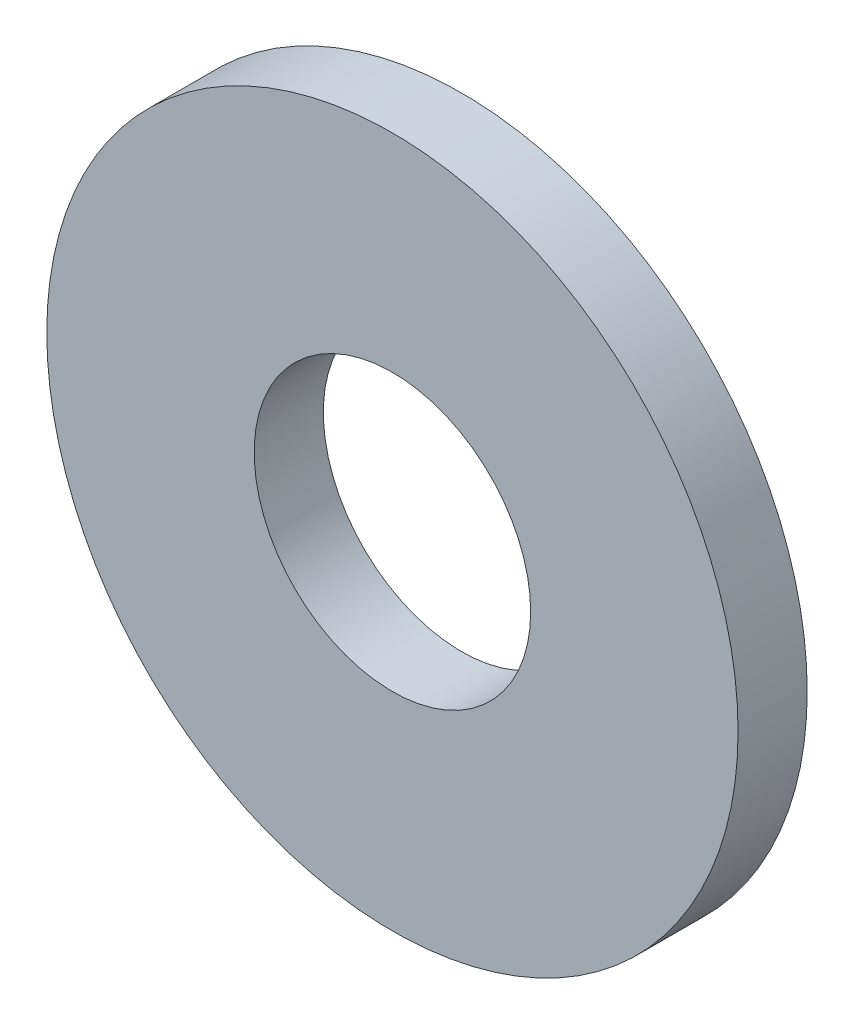
ISO-10303-21;
HEADER;
FILE_DESCRIPTION(('STEP AP214'),'2;1');
FILE_NAME('part.step','',(''),(''),'','','');
FILE_SCHEMA(('AUTOMOTIVE_DESIGN { 1 0 10303 214 1 1 1 1 }'));
ENDSEC;
DATA;
#1=APPLICATION_CONTEXT('core data for automotive mechanical design processes');
#2=APPLICATION_PROTOCOL_DEFINITION('international standard','automotive_design',2000,#1);
#3=PRODUCT_CONTEXT('',#1,'mechanical');
#4=PRODUCT('Part','Part','',(#3));
#5=PRODUCT_RELATED_PRODUCT_CATEGORY('part','',(#4));
#6=PRODUCT_DEFINITION_FORMATION('','',#4);
#7=PRODUCT_DEFINITION_CONTEXT('part definition',#1,'design');
#8=PRODUCT_DEFINITION('design','',#6,#7);
#9=PRODUCT_DEFINITION_SHAPE('','',#8);
#10=(LENGTH_UNIT() NAMED_UNIT(*) SI_UNIT(.MILLI.,.METRE.));
#11=(NAMED_UNIT(*) PLANE_ANGLE_UNIT() SI_UNIT($,.RADIAN.));
#12=(NAMED_UNIT(*) SI_UNIT($,.STERADIAN.) SOLID_ANGLE_UNIT());
#13=UNCERTAINTY_MEASURE_WITH_UNIT(LENGTH_MEASURE(1.E-05),#10,'distance_accuracy_value','');
#14=(GEOMETRIC_REPRESENTATION_CONTEXT(3) GLOBAL_UNCERTAINTY_ASSIGNED_CONTEXT((#13)) GLOBAL_UNIT_ASSIGNED_CONTEXT((#10,
#11,#12)) REPRESENTATION_CONTEXT('',''));
#15=CARTESIAN_POINT('',(0.,0.,0.));
#16=DIRECTION('',(0.,0.,1.));
#17=DIRECTION('',(1.,0.,0.));
#18=AXIS2_PLACEMENT_3D('',#15,#16,#17);
#19=CARTESIAN_POINT('',(0.,0.,1.));
#20=DIRECTION('',(0.,0.,1.));
#21=DIRECTION('',(1.,0.,0.));
#22=AXIS2_PLACEMENT_3D('',#19,#20,#21);
#23=PLANE('',#22);
#24=CARTESIAN_POINT('',(0.,0.,1.));
#25=DIRECTION('',(0.,0.,1.));
#26=DIRECTION('',(1.,0.,0.));
#27=AXIS2_PLACEMENT_3D('',#24,#25,#26);
#28=CIRCLE('',#27,5.);
#29=CARTESIAN_POINT('',(5.,0.,1.));
#30=VERTEX_POINT('',#29);
#31=EDGE_CURVE('E10',#30,#30,#28,.T.);
#32=ORIENTED_EDGE('',*,*,#31,.T.);
#33=EDGE_LOOP('',(#32));
#34=FACE_BOUND('',#33,.T.);
#35=CARTESIAN_POINT('',(0.,0.,1.));
#36=DIRECTION('',(0.,0.,1.));
#37=DIRECTION('',(1.,0.,0.));
#38=AXIS2_PLACEMENT_3D('',#35,#36,#37);
#39=CIRCLE('',#38,2.);
#40=CARTESIAN_POINT('',(2.,0.,1.));
#41=VERTEX_POINT('',#40);
#42=EDGE_CURVE('E43',#41,#41,#39,.T.);
#43=ORIENTED_EDGE('',*,*,#42,.F.);
#44=EDGE_LOOP('',(#43));
#45=FACE_BOUND('',#44,.T.);
#46=ADVANCED_FACE('F32',(#34,#45),#23,.T.);
#47=CARTESIAN_POINT('',(0.,0.,0.));
#48=DIRECTION('',(0.,0.,1.));
#49=DIRECTION('',(1.,0.,0.));
#50=AXIS2_PLACEMENT_3D('',#47,#48,#49);
#51=PLANE('',#50);
#52=CARTESIAN_POINT('',(0.,0.,0.));
#53=DIRECTION('',(0.,0.,1.));
#54=DIRECTION('',(1.,0.,0.));
#55=AXIS2_PLACEMENT_3D('',#52,#53,#54);
#56=CIRCLE('',#55,5.);
#57=CARTESIAN_POINT('',(5.,0.,0.));
#58=VERTEX_POINT('',#57);
#59=EDGE_CURVE('E36',#58,#58,#56,.T.);
#60=ORIENTED_EDGE('',*,*,#59,.F.);
#61=EDGE_LOOP('',(#60));
#62=FACE_BOUND('',#61,.T.);
#63=CARTESIAN_POINT('',(0.,0.,0.));
#64=DIRECTION('',(0.,0.,1.));
#65=DIRECTION('',(1.,0.,0.));
#66=AXIS2_PLACEMENT_3D('',#63,#64,#65);
#67=CIRCLE('',#66,2.);
#68=CARTESIAN_POINT('',(2.,0.,0.));
#69=VERTEX_POINT('',#68);
#70=EDGE_CURVE('E45',#69,#69,#67,.T.);
#71=ORIENTED_EDGE('',*,*,#70,.T.);
#72=EDGE_LOOP('',(#71));
#73=FACE_BOUND('',#72,.T.);
#74=ADVANCED_FACE('F55',(#62,#73),#51,.F.);
#75=CARTESIAN_POINT('',(0.,0.,1.));
#76=DIRECTION('',(0.,0.,-1.));
#77=DIRECTION('',(-1.,0.,0.));
#78=AXIS2_PLACEMENT_3D('',#75,#76,#77);
#79=CYLINDRICAL_SURFACE('',#78,5.);
#80=ORIENTED_EDGE('',*,*,#31,.F.);
#81=EDGE_LOOP('',(#80));
#82=FACE_BOUND('',#81,.T.);
#83=ORIENTED_EDGE('',*,*,#59,.T.);
#84=EDGE_LOOP('',(#83));
#85=FACE_BOUND('',#84,.T.);
#86=ADVANCED_FACE('F34',(#82,#85),#79,.T.);
#87=CARTESIAN_POINT('',(0.,0.,1.));
#88=DIRECTION('',(0.,0.,-1.));
#89=DIRECTION('',(-1.,0.,0.));
#90=AXIS2_PLACEMENT_3D('',#87,#88,#89);
#91=CYLINDRICAL_SURFACE('',#90,2.);
#92=ORIENTED_EDGE('',*,*,#42,.T.);
#93=EDGE_LOOP('',(#92));
#94=FACE_BOUND('',#93,.T.);
#95=ORIENTED_EDGE('',*,*,#70,.F.);
#96=EDGE_LOOP('',(#95));
#97=FACE_BOUND('',#96,.T.);
#98=ADVANCED_FACE('F51',(#94,#97),#91,.F.);
#99=CLOSED_SHELL('',(#46,#74,#86,#98));
#100=MANIFOLD_SOLID_BREP('B2',#99);
#101=ADVANCED_BREP_SHAPE_REPRESENTATION('',(#18,#100),#14);
#102=SHAPE_DEFINITION_REPRESENTATION(#9,#101);
ENDSEC;
END-ISO-10303-21;
